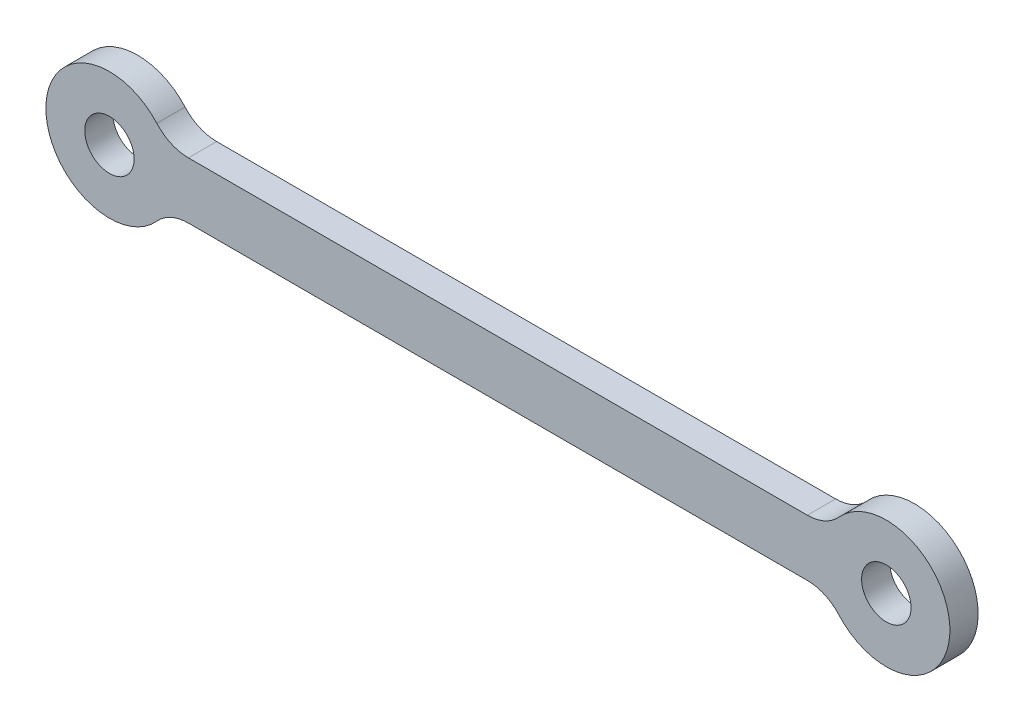
ISO-10303-21;
HEADER;
FILE_DESCRIPTION(('STEP AP214'),'2;1');
FILE_NAME('part.step','',(''),(''),'','','');
FILE_SCHEMA(('AUTOMOTIVE_DESIGN { 1 0 10303 214 1 1 1 1 }'));
ENDSEC;
DATA;
#1=APPLICATION_CONTEXT('core data for automotive mechanical design processes');
#2=APPLICATION_PROTOCOL_DEFINITION('international standard','automotive_design',2000,#1);
#3=PRODUCT_CONTEXT('',#1,'mechanical');
#4=PRODUCT('Part','Part','',(#3));
#5=PRODUCT_RELATED_PRODUCT_CATEGORY('part','',(#4));
#6=PRODUCT_DEFINITION_FORMATION('','',#4);
#7=PRODUCT_DEFINITION_CONTEXT('part definition',#1,'design');
#8=PRODUCT_DEFINITION('design','',#6,#7);
#9=PRODUCT_DEFINITION_SHAPE('','',#8);
#10=(LENGTH_UNIT() NAMED_UNIT(*) SI_UNIT(.MILLI.,.METRE.));
#11=(NAMED_UNIT(*) PLANE_ANGLE_UNIT() SI_UNIT($,.RADIAN.));
#12=(NAMED_UNIT(*) SI_UNIT($,.STERADIAN.) SOLID_ANGLE_UNIT());
#13=UNCERTAINTY_MEASURE_WITH_UNIT(LENGTH_MEASURE(1.E-05),#10,'distance_accuracy_value','');
#14=(GEOMETRIC_REPRESENTATION_CONTEXT(3) GLOBAL_UNCERTAINTY_ASSIGNED_CONTEXT((#13)) GLOBAL_UNIT_ASSIGNED_CONTEXT((#10,
#11,#12)) REPRESENTATION_CONTEXT('',''));
#15=CARTESIAN_POINT('',(0.,0.,0.));
#16=DIRECTION('',(0.,0.,1.));
#17=DIRECTION('',(1.,0.,0.));
#18=AXIS2_PLACEMENT_3D('',#15,#16,#17);
#19=CARTESIAN_POINT('',(49.4098300562505,-5.,2.));
#20=DIRECTION('',(0.,0.,1.));
#21=DIRECTION('',(1.,0.,0.));
#22=AXIS2_PLACEMENT_3D('',#19,#20,#21);
#23=PLANE('',#22);
#24=CARTESIAN_POINT('',(0.,0.,2.));
#25=DIRECTION('',(0.,0.,1.));
#26=DIRECTION('',(1.,0.,0.));
#27=AXIS2_PLACEMENT_3D('',#24,#25,#26);
#28=CIRCLE('',#27,1.75);
#29=CARTESIAN_POINT('',(1.75,0.,2.));
#30=VERTEX_POINT('',#29);
#31=EDGE_CURVE('E138',#30,#30,#28,.T.);
#32=ORIENTED_EDGE('',*,*,#31,.F.);
#33=EDGE_LOOP('',(#32));
#34=FACE_BOUND('',#33,.T.);
#35=CARTESIAN_POINT('',(49.4098300562505,-5.,2.));
#36=DIRECTION('',(0.,0.,-1.));
#37=DIRECTION('',(1.,0.,0.));
#38=AXIS2_PLACEMENT_3D('',#35,#36,#37);
#39=CIRCLE('',#38,3.);
#40=CARTESIAN_POINT('',(49.4098300562505,-2.,2.));
#41=VERTEX_POINT('',#40);
#42=CARTESIAN_POINT('',(51.6458980337503,-3.,2.));
#43=VERTEX_POINT('',#42);
#44=EDGE_CURVE('E149',#41,#43,#39,.T.);
#45=ORIENTED_EDGE('',*,*,#44,.T.);
#46=CARTESIAN_POINT('',(55.,0.,2.));
#47=DIRECTION('',(0.,0.,1.));
#48=DIRECTION('',(1.,0.,0.));
#49=AXIS2_PLACEMENT_3D('',#46,#47,#48);
#50=CIRCLE('',#49,4.5);
#51=CARTESIAN_POINT('',(51.6458980337503,3.,2.));
#52=VERTEX_POINT('',#51);
#53=EDGE_CURVE('E97',#43,#52,#50,.T.);
#54=ORIENTED_EDGE('',*,*,#53,.T.);
#55=CARTESIAN_POINT('',(49.4098300562505,5.,2.));
#56=DIRECTION('',(0.,0.,-1.));
#57=DIRECTION('',(1.,0.,0.));
#58=AXIS2_PLACEMENT_3D('',#55,#56,#57);
#59=CIRCLE('',#58,3.);
#60=CARTESIAN_POINT('',(49.4098300562505,2.,2.));
#61=VERTEX_POINT('',#60);
#62=EDGE_CURVE('E164',#52,#61,#59,.T.);
#63=ORIENTED_EDGE('',*,*,#62,.T.);
#64=DIRECTION('',(-1.,0.,0.));
#65=VECTOR('',#64,1.);
#66=CARTESIAN_POINT('',(5.5901699437495,1.99999999999998,2.));
#67=LINE('',#66,#65);
#68=CARTESIAN_POINT('',(5.5901699437495,1.99999999999998,2.));
#69=VERTEX_POINT('',#68);
#70=EDGE_CURVE('E177',#61,#69,#67,.T.);
#71=ORIENTED_EDGE('',*,*,#70,.T.);
#72=CARTESIAN_POINT('',(5.5901699437495,4.99999999999998,2.));
#73=DIRECTION('',(0.,0.,-1.));
#74=DIRECTION('',(-1.,0.,0.));
#75=AXIS2_PLACEMENT_3D('',#72,#73,#74);
#76=CIRCLE('',#75,3.);
#77=CARTESIAN_POINT('',(3.3541019662497,2.99999999999999,2.));
#78=VERTEX_POINT('',#77);
#79=EDGE_CURVE('E116',#69,#78,#76,.T.);
#80=ORIENTED_EDGE('',*,*,#79,.T.);
#81=CARTESIAN_POINT('',(0.,0.,2.));
#82=DIRECTION('',(0.,0.,1.));
#83=DIRECTION('',(1.,0.,0.));
#84=AXIS2_PLACEMENT_3D('',#81,#82,#83);
#85=CIRCLE('',#84,4.5);
#86=CARTESIAN_POINT('',(3.35410196624966,-3.00000000000002,2.));
#87=VERTEX_POINT('',#86);
#88=EDGE_CURVE('E110',#78,#87,#85,.T.);
#89=ORIENTED_EDGE('',*,*,#88,.T.);
#90=CARTESIAN_POINT('',(5.59016994374945,-5.00000000000003,2.));
#91=DIRECTION('',(0.,0.,-1.));
#92=DIRECTION('',(1.,0.,0.));
#93=AXIS2_PLACEMENT_3D('',#90,#91,#92);
#94=CIRCLE('',#93,3.);
#95=CARTESIAN_POINT('',(5.59016994374945,-2.00000000000002,2.));
#96=VERTEX_POINT('',#95);
#97=EDGE_CURVE('E114',#87,#96,#94,.T.);
#98=ORIENTED_EDGE('',*,*,#97,.T.);
#99=DIRECTION('',(1.,0.,0.));
#100=VECTOR('',#99,1.);
#101=CARTESIAN_POINT('',(49.4098300562505,-2.,2.));
#102=LINE('',#101,#100);
#103=EDGE_CURVE('E54',#96,#41,#102,.T.);
#104=ORIENTED_EDGE('',*,*,#103,.T.);
#105=EDGE_LOOP('',(#45,#54,#63,#71,#80,#89,#98,#104));
#106=FACE_BOUND('',#105,.T.);
#107=CARTESIAN_POINT('',(55.,0.,2.));
#108=DIRECTION('',(0.,0.,1.));
#109=DIRECTION('',(1.,0.,0.));
#110=AXIS2_PLACEMENT_3D('',#107,#108,#109);
#111=CIRCLE('',#110,1.75);
#112=CARTESIAN_POINT('',(56.75,0.,2.));
#113=VERTEX_POINT('',#112);
#114=EDGE_CURVE('E186',#113,#113,#111,.T.);
#115=ORIENTED_EDGE('',*,*,#114,.F.);
#116=EDGE_LOOP('',(#115));
#117=FACE_BOUND('',#116,.T.);
#118=ADVANCED_FACE('F37',(#34,#106,#117),#23,.T.);
#119=CARTESIAN_POINT('',(49.4098300562505,-5.,0.));
#120=DIRECTION('',(0.,0.,1.));
#121=DIRECTION('',(1.,0.,0.));
#122=AXIS2_PLACEMENT_3D('',#119,#120,#121);
#123=PLANE('',#122);
#124=CARTESIAN_POINT('',(49.4098300562505,-5.,0.));
#125=DIRECTION('',(0.,0.,-1.));
#126=DIRECTION('',(1.,0.,0.));
#127=AXIS2_PLACEMENT_3D('',#124,#125,#126);
#128=CIRCLE('',#127,3.);
#129=CARTESIAN_POINT('',(49.4098300562505,-2.,0.));
#130=VERTEX_POINT('',#129);
#131=CARTESIAN_POINT('',(51.6458980337503,-3.,0.));
#132=VERTEX_POINT('',#131);
#133=EDGE_CURVE('E134',#130,#132,#128,.T.);
#134=ORIENTED_EDGE('',*,*,#133,.F.);
#135=DIRECTION('',(1.,0.,0.));
#136=VECTOR('',#135,1.);
#137=CARTESIAN_POINT('',(49.4098300562505,-2.,0.));
#138=LINE('',#137,#136);
#139=CARTESIAN_POINT('',(5.59016994374945,-2.00000000000002,0.));
#140=VERTEX_POINT('',#139);
#141=EDGE_CURVE('E89',#140,#130,#138,.T.);
#142=ORIENTED_EDGE('',*,*,#141,.F.);
#143=CARTESIAN_POINT('',(5.59016994374945,-5.00000000000003,0.));
#144=DIRECTION('',(0.,0.,-1.));
#145=DIRECTION('',(1.,0.,0.));
#146=AXIS2_PLACEMENT_3D('',#143,#144,#145);
#147=CIRCLE('',#146,3.);
#148=CARTESIAN_POINT('',(3.35410196624966,-3.00000000000002,0.));
#149=VERTEX_POINT('',#148);
#150=EDGE_CURVE('E83',#149,#140,#147,.T.);
#151=ORIENTED_EDGE('',*,*,#150,.F.);
#152=CARTESIAN_POINT('',(0.,0.,0.));
#153=DIRECTION('',(0.,0.,1.));
#154=DIRECTION('',(1.,0.,0.));
#155=AXIS2_PLACEMENT_3D('',#152,#153,#154);
#156=CIRCLE('',#155,4.5);
#157=CARTESIAN_POINT('',(3.3541019662497,2.99999999999999,0.));
#158=VERTEX_POINT('',#157);
#159=EDGE_CURVE('E124',#158,#149,#156,.T.);
#160=ORIENTED_EDGE('',*,*,#159,.F.);
#161=CARTESIAN_POINT('',(5.5901699437495,4.99999999999998,0.));
#162=DIRECTION('',(0.,0.,-1.));
#163=DIRECTION('',(-1.,0.,0.));
#164=AXIS2_PLACEMENT_3D('',#161,#162,#163);
#165=CIRCLE('',#164,3.);
#166=CARTESIAN_POINT('',(5.5901699437495,1.99999999999998,0.));
#167=VERTEX_POINT('',#166);
#168=EDGE_CURVE('E144',#167,#158,#165,.T.);
#169=ORIENTED_EDGE('',*,*,#168,.F.);
#170=DIRECTION('',(-1.,0.,0.));
#171=VECTOR('',#170,1.);
#172=CARTESIAN_POINT('',(5.5901699437495,1.99999999999998,0.));
#173=LINE('',#172,#171);
#174=CARTESIAN_POINT('',(49.4098300562505,2.,0.));
#175=VERTEX_POINT('',#174);
#176=EDGE_CURVE('E142',#175,#167,#173,.T.);
#177=ORIENTED_EDGE('',*,*,#176,.F.);
#178=CARTESIAN_POINT('',(49.4098300562505,5.,0.));
#179=DIRECTION('',(0.,0.,-1.));
#180=DIRECTION('',(1.,0.,0.));
#181=AXIS2_PLACEMENT_3D('',#178,#179,#180);
#182=CIRCLE('',#181,3.);
#183=CARTESIAN_POINT('',(51.6458980337503,3.,0.));
#184=VERTEX_POINT('',#183);
#185=EDGE_CURVE('E140',#184,#175,#182,.T.);
#186=ORIENTED_EDGE('',*,*,#185,.F.);
#187=CARTESIAN_POINT('',(55.,0.,0.));
#188=DIRECTION('',(0.,0.,1.));
#189=DIRECTION('',(1.,0.,0.));
#190=AXIS2_PLACEMENT_3D('',#187,#188,#189);
#191=CIRCLE('',#190,4.5);
#192=EDGE_CURVE('E137',#132,#184,#191,.T.);
#193=ORIENTED_EDGE('',*,*,#192,.F.);
#194=EDGE_LOOP('',(#134,#142,#151,#160,#169,#177,#186,#193));
#195=FACE_BOUND('',#194,.T.);
#196=CARTESIAN_POINT('',(0.,0.,0.));
#197=DIRECTION('',(0.,0.,1.));
#198=DIRECTION('',(1.,0.,0.));
#199=AXIS2_PLACEMENT_3D('',#196,#197,#198);
#200=CIRCLE('',#199,1.75);
#201=CARTESIAN_POINT('',(1.75,0.,0.));
#202=VERTEX_POINT('',#201);
#203=EDGE_CURVE('E183',#202,#202,#200,.T.);
#204=ORIENTED_EDGE('',*,*,#203,.T.);
#205=EDGE_LOOP('',(#204));
#206=FACE_BOUND('',#205,.T.);
#207=CARTESIAN_POINT('',(55.,0.,0.));
#208=DIRECTION('',(0.,0.,1.));
#209=DIRECTION('',(1.,0.,0.));
#210=AXIS2_PLACEMENT_3D('',#207,#208,#209);
#211=CIRCLE('',#210,1.75);
#212=CARTESIAN_POINT('',(56.75,0.,0.));
#213=VERTEX_POINT('',#212);
#214=EDGE_CURVE('E189',#213,#213,#211,.T.);
#215=ORIENTED_EDGE('',*,*,#214,.T.);
#216=EDGE_LOOP('',(#215));
#217=FACE_BOUND('',#216,.T.);
#218=ADVANCED_FACE('F168',(#195,#206,#217),#123,.F.);
#219=CARTESIAN_POINT('',(49.4098300562505,-5.,2.));
#220=DIRECTION('',(0.,0.,-1.));
#221=DIRECTION('',(-1.,0.,0.));
#222=AXIS2_PLACEMENT_3D('',#219,#220,#221);
#223=CYLINDRICAL_SURFACE('',#222,3.);
#224=ORIENTED_EDGE('',*,*,#133,.T.);
#225=DIRECTION('',(0.,0.,-1.));
#226=VECTOR('',#225,1.);
#227=CARTESIAN_POINT('',(51.6458980337503,-3.,2.));
#228=LINE('',#227,#226);
#229=EDGE_CURVE('E11',#43,#132,#228,.T.);
#230=ORIENTED_EDGE('',*,*,#229,.F.);
#231=ORIENTED_EDGE('',*,*,#44,.F.);
#232=DIRECTION('',(0.,0.,-1.));
#233=VECTOR('',#232,1.);
#234=CARTESIAN_POINT('',(49.4098300562505,-2.,2.));
#235=LINE('',#234,#233);
#236=EDGE_CURVE('E130',#41,#130,#235,.T.);
#237=ORIENTED_EDGE('',*,*,#236,.T.);
#238=EDGE_LOOP('',(#224,#230,#231,#237));
#239=FACE_BOUND('',#238,.T.);
#240=ADVANCED_FACE('F39',(#239),#223,.F.);
#241=CARTESIAN_POINT('',(55.,0.,2.));
#242=DIRECTION('',(0.,0.,-1.));
#243=DIRECTION('',(-1.,0.,0.));
#244=AXIS2_PLACEMENT_3D('',#241,#242,#243);
#245=CYLINDRICAL_SURFACE('',#244,4.5);
#246=ORIENTED_EDGE('',*,*,#192,.T.);
#247=DIRECTION('',(0.,0.,-1.));
#248=VECTOR('',#247,1.);
#249=CARTESIAN_POINT('',(51.6458980337503,3.,2.));
#250=LINE('',#249,#248);
#251=EDGE_CURVE('E46',#52,#184,#250,.T.);
#252=ORIENTED_EDGE('',*,*,#251,.F.);
#253=ORIENTED_EDGE('',*,*,#53,.F.);
#254=ORIENTED_EDGE('',*,*,#229,.T.);
#255=EDGE_LOOP('',(#246,#252,#253,#254));
#256=FACE_BOUND('',#255,.T.);
#257=ADVANCED_FACE('F221',(#256),#245,.T.);
#258=CARTESIAN_POINT('',(49.4098300562505,5.,2.));
#259=DIRECTION('',(0.,0.,-1.));
#260=DIRECTION('',(-1.,0.,0.));
#261=AXIS2_PLACEMENT_3D('',#258,#259,#260);
#262=CYLINDRICAL_SURFACE('',#261,3.);
#263=ORIENTED_EDGE('',*,*,#185,.T.);
#264=DIRECTION('',(0.,0.,-1.));
#265=VECTOR('',#264,1.);
#266=CARTESIAN_POINT('',(49.4098300562505,2.,2.));
#267=LINE('',#266,#265);
#268=EDGE_CURVE('E156',#61,#175,#267,.T.);
#269=ORIENTED_EDGE('',*,*,#268,.F.);
#270=ORIENTED_EDGE('',*,*,#62,.F.);
#271=ORIENTED_EDGE('',*,*,#251,.T.);
#272=EDGE_LOOP('',(#263,#269,#270,#271));
#273=FACE_BOUND('',#272,.T.);
#274=ADVANCED_FACE('F162',(#273),#262,.F.);
#275=CARTESIAN_POINT('',(5.5901699437495,1.99999999999998,2.));
#276=DIRECTION('',(0.,-1.,0.));
#277=DIRECTION('',(1.,0.,0.));
#278=AXIS2_PLACEMENT_3D('',#275,#276,#277);
#279=PLANE('',#278);
#280=ORIENTED_EDGE('',*,*,#176,.T.);
#281=DIRECTION('',(0.,0.,-1.));
#282=VECTOR('',#281,1.);
#283=CARTESIAN_POINT('',(5.5901699437495,1.99999999999998,2.));
#284=LINE('',#283,#282);
#285=EDGE_CURVE('E153',#69,#167,#284,.T.);
#286=ORIENTED_EDGE('',*,*,#285,.F.);
#287=ORIENTED_EDGE('',*,*,#70,.F.);
#288=ORIENTED_EDGE('',*,*,#268,.T.);
#289=EDGE_LOOP('',(#280,#286,#287,#288));
#290=FACE_BOUND('',#289,.T.);
#291=ADVANCED_FACE('F173',(#290),#279,.F.);
#292=CARTESIAN_POINT('',(5.5901699437495,4.99999999999998,2.));
#293=DIRECTION('',(0.,0.,-1.));
#294=DIRECTION('',(-1.,0.,0.));
#295=AXIS2_PLACEMENT_3D('',#292,#293,#294);
#296=CYLINDRICAL_SURFACE('',#295,3.);
#297=ORIENTED_EDGE('',*,*,#168,.T.);
#298=DIRECTION('',(0.,0.,-1.));
#299=VECTOR('',#298,1.);
#300=CARTESIAN_POINT('',(3.3541019662497,2.99999999999999,2.));
#301=LINE('',#300,#299);
#302=EDGE_CURVE('E125',#78,#158,#301,.T.);
#303=ORIENTED_EDGE('',*,*,#302,.F.);
#304=ORIENTED_EDGE('',*,*,#79,.F.);
#305=ORIENTED_EDGE('',*,*,#285,.T.);
#306=EDGE_LOOP('',(#297,#303,#304,#305));
#307=FACE_BOUND('',#306,.T.);
#308=ADVANCED_FACE('F176',(#307),#296,.F.);
#309=CARTESIAN_POINT('',(0.,0.,2.));
#310=DIRECTION('',(0.,0.,-1.));
#311=DIRECTION('',(-1.,0.,0.));
#312=AXIS2_PLACEMENT_3D('',#309,#310,#311);
#313=CYLINDRICAL_SURFACE('',#312,4.5);
#314=ORIENTED_EDGE('',*,*,#159,.T.);
#315=DIRECTION('',(0.,0.,-1.));
#316=VECTOR('',#315,1.);
#317=CARTESIAN_POINT('',(3.35410196624966,-3.00000000000002,2.));
#318=LINE('',#317,#316);
#319=EDGE_CURVE('E121',#87,#149,#318,.T.);
#320=ORIENTED_EDGE('',*,*,#319,.F.);
#321=ORIENTED_EDGE('',*,*,#88,.F.);
#322=ORIENTED_EDGE('',*,*,#302,.T.);
#323=EDGE_LOOP('',(#314,#320,#321,#322));
#324=FACE_BOUND('',#323,.T.);
#325=ADVANCED_FACE('F122',(#324),#313,.T.);
#326=CARTESIAN_POINT('',(5.59016994374945,-5.00000000000003,2.));
#327=DIRECTION('',(0.,0.,-1.));
#328=DIRECTION('',(-1.,0.,0.));
#329=AXIS2_PLACEMENT_3D('',#326,#327,#328);
#330=CYLINDRICAL_SURFACE('',#329,3.);
#331=ORIENTED_EDGE('',*,*,#150,.T.);
#332=DIRECTION('',(0.,0.,-1.));
#333=VECTOR('',#332,1.);
#334=CARTESIAN_POINT('',(5.59016994374945,-2.00000000000002,2.));
#335=LINE('',#334,#333);
#336=EDGE_CURVE('E126',#96,#140,#335,.T.);
#337=ORIENTED_EDGE('',*,*,#336,.F.);
#338=ORIENTED_EDGE('',*,*,#97,.F.);
#339=ORIENTED_EDGE('',*,*,#319,.T.);
#340=EDGE_LOOP('',(#331,#337,#338,#339));
#341=FACE_BOUND('',#340,.T.);
#342=ADVANCED_FACE('F128',(#341),#330,.F.);
#343=CARTESIAN_POINT('',(49.4098300562505,-2.,2.));
#344=DIRECTION('',(0.,1.,0.));
#345=DIRECTION('',(-1.,0.,0.));
#346=AXIS2_PLACEMENT_3D('',#343,#344,#345);
#347=PLANE('',#346);
#348=ORIENTED_EDGE('',*,*,#141,.T.);
#349=ORIENTED_EDGE('',*,*,#236,.F.);
#350=ORIENTED_EDGE('',*,*,#103,.F.);
#351=ORIENTED_EDGE('',*,*,#336,.T.);
#352=EDGE_LOOP('',(#348,#349,#350,#351));
#353=FACE_BOUND('',#352,.T.);
#354=ADVANCED_FACE('F209',(#353),#347,.F.);
#355=CARTESIAN_POINT('',(0.,0.,2.));
#356=DIRECTION('',(0.,0.,-1.));
#357=DIRECTION('',(-1.,0.,0.));
#358=AXIS2_PLACEMENT_3D('',#355,#356,#357);
#359=CYLINDRICAL_SURFACE('',#358,1.75);
#360=ORIENTED_EDGE('',*,*,#31,.T.);
#361=EDGE_LOOP('',(#360));
#362=FACE_BOUND('',#361,.T.);
#363=ORIENTED_EDGE('',*,*,#203,.F.);
#364=EDGE_LOOP('',(#363));
#365=FACE_BOUND('',#364,.T.);
#366=ADVANCED_FACE('F206',(#362,#365),#359,.F.);
#367=CARTESIAN_POINT('',(55.,0.,2.));
#368=DIRECTION('',(0.,0.,-1.));
#369=DIRECTION('',(-1.,0.,0.));
#370=AXIS2_PLACEMENT_3D('',#367,#368,#369);
#371=CYLINDRICAL_SURFACE('',#370,1.75);
#372=ORIENTED_EDGE('',*,*,#114,.T.);
#373=EDGE_LOOP('',(#372));
#374=FACE_BOUND('',#373,.T.);
#375=ORIENTED_EDGE('',*,*,#214,.F.);
#376=EDGE_LOOP('',(#375));
#377=FACE_BOUND('',#376,.T.);
#378=ADVANCED_FACE('F195',(#374,#377),#371,.F.);
#379=CLOSED_SHELL('',(#118,#218,#240,#257,#274,#291,#308,#325,#342,#354,#366,#378));
#380=MANIFOLD_SOLID_BREP('B2',#379);
#381=ADVANCED_BREP_SHAPE_REPRESENTATION('',(#18,#380),#14);
#382=SHAPE_DEFINITION_REPRESENTATION(#9,#381);
ENDSEC;
END-ISO-10303-21;
